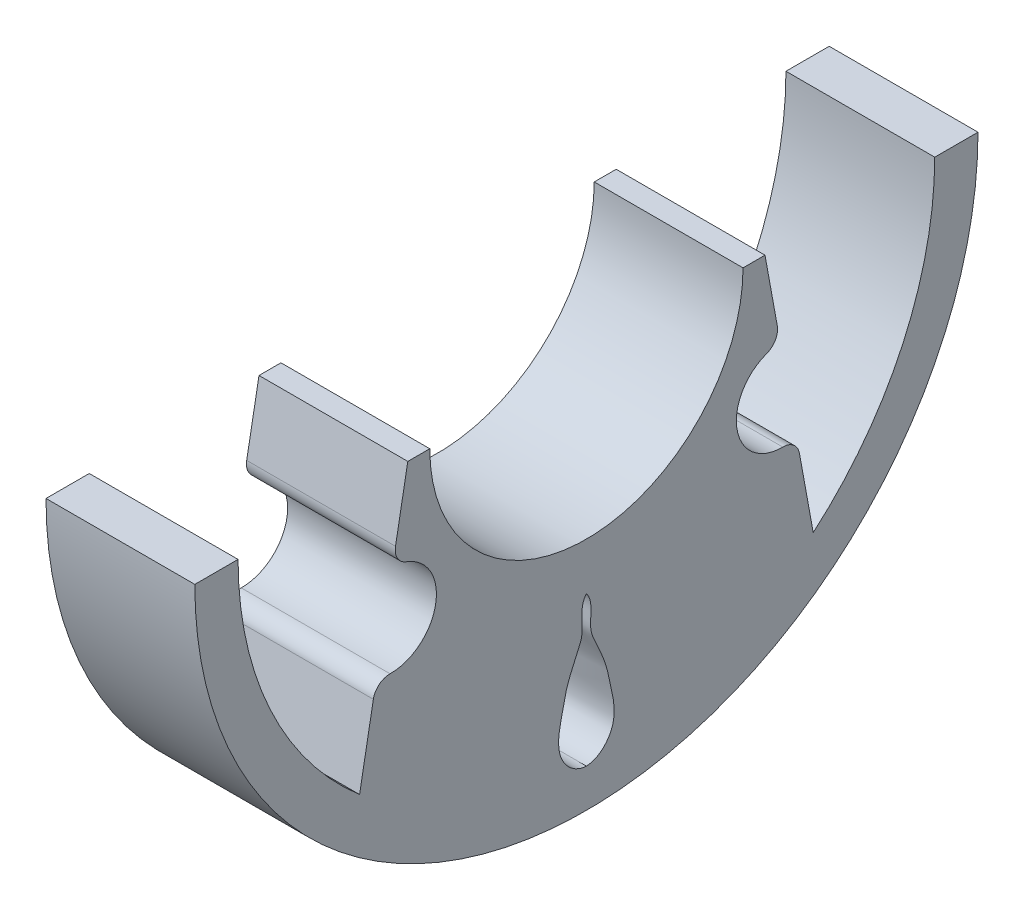
ISO-10303-21;
HEADER;
FILE_DESCRIPTION(('STEP AP214'),'2;1');
FILE_NAME('part.step','',(''),(''),'','','');
FILE_SCHEMA(('AUTOMOTIVE_DESIGN { 1 0 10303 214 1 1 1 1 }'));
ENDSEC;
DATA;
#1=APPLICATION_CONTEXT('core data for automotive mechanical design processes');
#2=APPLICATION_PROTOCOL_DEFINITION('international standard','automotive_design',2000,#1);
#3=PRODUCT_CONTEXT('',#1,'mechanical');
#4=PRODUCT('Part','Part','',(#3));
#5=PRODUCT_RELATED_PRODUCT_CATEGORY('part','',(#4));
#6=PRODUCT_DEFINITION_FORMATION('','',#4);
#7=PRODUCT_DEFINITION_CONTEXT('part definition',#1,'design');
#8=PRODUCT_DEFINITION('design','',#6,#7);
#9=PRODUCT_DEFINITION_SHAPE('','',#8);
#10=(LENGTH_UNIT() NAMED_UNIT(*) SI_UNIT(.MILLI.,.METRE.));
#11=(NAMED_UNIT(*) PLANE_ANGLE_UNIT() SI_UNIT($,.RADIAN.));
#12=(NAMED_UNIT(*) SI_UNIT($,.STERADIAN.) SOLID_ANGLE_UNIT());
#13=UNCERTAINTY_MEASURE_WITH_UNIT(LENGTH_MEASURE(1.E-05),#10,'distance_accuracy_value','');
#14=(GEOMETRIC_REPRESENTATION_CONTEXT(3) GLOBAL_UNCERTAINTY_ASSIGNED_CONTEXT((#13)) GLOBAL_UNIT_ASSIGNED_CONTEXT((#10,
#11,#12)) REPRESENTATION_CONTEXT('',''));
#15=CARTESIAN_POINT('',(0.,0.,0.));
#16=DIRECTION('',(0.,0.,1.));
#17=DIRECTION('',(1.,0.,0.));
#18=AXIS2_PLACEMENT_3D('',#15,#16,#17);
#19=CARTESIAN_POINT('',(38.,-33.,50.));
#20=DIRECTION('',(-1.,0.,0.));
#21=DIRECTION('',(0.,0.,1.));
#22=AXIS2_PLACEMENT_3D('',#19,#20,#21);
#23=CYLINDRICAL_SURFACE('',#22,11.7046999107196);
#24=CARTESIAN_POINT('',(0.,-33.,50.));
#25=DIRECTION('',(1.,0.,0.));
#26=DIRECTION('',(0.,0.,-1.));
#27=AXIS2_PLACEMENT_3D('',#24,#25,#26);
#28=CIRCLE('',#27,11.7046999107196);
#29=CARTESIAN_POINT('',(0.,-44.7038379199084,50.1420490919172));
#30=VERTEX_POINT('',#29);
#31=CARTESIAN_POINT('',(0.,-22.0000232506638,45.999936061253));
#32=VERTEX_POINT('',#31);
#33=EDGE_CURVE('E283',#30,#32,#28,.T.);
#34=ORIENTED_EDGE('',*,*,#33,.F.);
#35=DIRECTION('',(-1.,0.,0.));
#36=VECTOR('',#35,1.);
#37=CARTESIAN_POINT('',(38.,-44.7038379199084,50.1420490919172));
#38=LINE('',#37,#36);
#39=CARTESIAN_POINT('',(38.,-44.7038379199084,50.1420490919172));
#40=VERTEX_POINT('',#39);
#41=EDGE_CURVE('E11',#40,#30,#38,.T.);
#42=ORIENTED_EDGE('',*,*,#41,.F.);
#43=CARTESIAN_POINT('',(38.,-33.,50.));
#44=DIRECTION('',(1.,0.,0.));
#45=DIRECTION('',(0.,0.,-1.));
#46=AXIS2_PLACEMENT_3D('',#43,#44,#45);
#47=CIRCLE('',#46,11.7046999107196);
#48=CARTESIAN_POINT('',(38.,-22.0000232506638,45.999936061253));
#49=VERTEX_POINT('',#48);
#50=EDGE_CURVE('E297',#40,#49,#47,.T.);
#51=ORIENTED_EDGE('',*,*,#50,.T.);
#52=DIRECTION('',(-1.,0.,0.));
#53=VECTOR('',#52,1.);
#54=CARTESIAN_POINT('',(38.,-22.0000232506638,45.999936061253));
#55=LINE('',#54,#53);
#56=EDGE_CURVE('E40',#49,#32,#55,.T.);
#57=ORIENTED_EDGE('',*,*,#56,.T.);
#58=EDGE_LOOP('',(#34,#42,#51,#57));
#59=FACE_BOUND('',#58,.T.);
#60=ADVANCED_FACE('F37',(#59),#23,.F.);
#61=CARTESIAN_POINT('',(38.,-48.9835227199716,50.1939914841223));
#62=DIRECTION('',(-1.,0.,0.));
#63=DIRECTION('',(0.,0.,1.));
#64=AXIS2_PLACEMENT_3D('',#61,#62,#63);
#65=CYLINDRICAL_SURFACE('',#64,4.27999999999999);
#66=CARTESIAN_POINT('',(0.,-48.9835227199716,50.1939914841223));
#67=DIRECTION('',(-1.,0.,0.));
#68=DIRECTION('',(0.,0.,1.));
#69=AXIS2_PLACEMENT_3D('',#66,#67,#68);
#70=CIRCLE('',#69,4.27999999999999);
#71=CARTESIAN_POINT('',(0.,-48.2153535782879,54.4044921870987));
#72=VERTEX_POINT('',#71);
#73=EDGE_CURVE('E293',#72,#30,#70,.T.);
#74=ORIENTED_EDGE('',*,*,#73,.F.);
#75=DIRECTION('',(-1.,0.,0.));
#76=VECTOR('',#75,1.);
#77=CARTESIAN_POINT('',(38.,-48.2153535782879,54.4044921870987));
#78=LINE('',#77,#76);
#79=CARTESIAN_POINT('',(38.,-48.2153535782879,54.4044921870987));
#80=VERTEX_POINT('',#79);
#81=EDGE_CURVE('E45',#80,#72,#78,.T.);
#82=ORIENTED_EDGE('',*,*,#81,.F.);
#83=CARTESIAN_POINT('',(38.,-48.9835227199716,50.1939914841223));
#84=DIRECTION('',(-1.,0.,0.));
#85=DIRECTION('',(0.,0.,1.));
#86=AXIS2_PLACEMENT_3D('',#83,#84,#85);
#87=CIRCLE('',#86,4.27999999999999);
#88=EDGE_CURVE('E336',#80,#40,#87,.T.);
#89=ORIENTED_EDGE('',*,*,#88,.T.);
#90=ORIENTED_EDGE('',*,*,#41,.T.);
#91=EDGE_LOOP('',(#74,#82,#89,#90));
#92=FACE_BOUND('',#91,.T.);
#93=ADVANCED_FACE('F209',(#92),#65,.T.);
#94=CARTESIAN_POINT('',(38.,-67.5108765879659,57.924792121547));
#95=DIRECTION('',(0.,0.179478771421425,0.983761846489818));
#96=DIRECTION('',(0.,-0.983761846489818,0.179478771421425));
#97=AXIS2_PLACEMENT_3D('',#94,#95,#96);
#98=PLANE('',#97);
#99=DIRECTION('',(0.,0.983761846489818,-0.179478771421425));
#100=VECTOR('',#99,1.);
#101=CARTESIAN_POINT('',(0.,-67.5108765879659,57.924792121547));
#102=LINE('',#101,#100);
#103=CARTESIAN_POINT('',(0.,-67.5108765879659,57.9247921215471));
#104=VERTEX_POINT('',#103);
#105=EDGE_CURVE('E296',#104,#72,#102,.T.);
#106=ORIENTED_EDGE('',*,*,#105,.F.);
#107=DIRECTION('',(-1.,0.,0.));
#108=VECTOR('',#107,1.);
#109=CARTESIAN_POINT('',(38.,-67.5108765879659,57.9247921215471));
#110=LINE('',#109,#108);
#111=CARTESIAN_POINT('',(38.,-67.5108765879659,57.9247921215471));
#112=VERTEX_POINT('',#111);
#113=EDGE_CURVE('E306',#112,#104,#110,.T.);
#114=ORIENTED_EDGE('',*,*,#113,.F.);
#115=DIRECTION('',(0.,0.983761846489818,-0.179478771421425));
#116=VECTOR('',#115,1.);
#117=CARTESIAN_POINT('',(38.,-67.5108765879659,57.924792121547));
#118=LINE('',#117,#116);
#119=EDGE_CURVE('E338',#112,#80,#118,.T.);
#120=ORIENTED_EDGE('',*,*,#119,.T.);
#121=ORIENTED_EDGE('',*,*,#81,.T.);
#122=EDGE_LOOP('',(#106,#114,#120,#121));
#123=FACE_BOUND('',#122,.T.);
#124=ADVANCED_FACE('F212',(#123),#98,.T.);
#125=CARTESIAN_POINT('',(38.,0.,0.));
#126=DIRECTION('',(-1.,0.,0.));
#127=DIRECTION('',(0.,0.,1.));
#128=AXIS2_PLACEMENT_3D('',#125,#126,#127);
#129=CYLINDRICAL_SURFACE('',#128,88.9550448260244);
#130=CARTESIAN_POINT('',(0.,0.,0.));
#131=DIRECTION('',(1.,0.,0.));
#132=DIRECTION('',(0.,0.,-1.));
#133=AXIS2_PLACEMENT_3D('',#130,#131,#132);
#134=CIRCLE('',#133,88.9550448260244);
#135=CARTESIAN_POINT('',(0.,0.,88.9550448260244));
#136=VERTEX_POINT('',#135);
#137=EDGE_CURVE('E301',#136,#104,#134,.T.);
#138=ORIENTED_EDGE('',*,*,#137,.F.);
#139=DIRECTION('',(-1.,0.,0.));
#140=VECTOR('',#139,1.);
#141=CARTESIAN_POINT('',(38.,0.,88.9550448260244));
#142=LINE('',#141,#140);
#143=CARTESIAN_POINT('',(38.,0.,88.9550448260244));
#144=VERTEX_POINT('',#143);
#145=EDGE_CURVE('E308',#144,#136,#142,.T.);
#146=ORIENTED_EDGE('',*,*,#145,.F.);
#147=CARTESIAN_POINT('',(38.,0.,0.));
#148=DIRECTION('',(1.,0.,0.));
#149=DIRECTION('',(0.,0.,-1.));
#150=AXIS2_PLACEMENT_3D('',#147,#148,#149);
#151=CIRCLE('',#150,88.9550448260244);
#152=EDGE_CURVE('E342',#144,#112,#151,.T.);
#153=ORIENTED_EDGE('',*,*,#152,.T.);
#154=ORIENTED_EDGE('',*,*,#113,.T.);
#155=EDGE_LOOP('',(#138,#146,#153,#154));
#156=FACE_BOUND('',#155,.T.);
#157=ADVANCED_FACE('F216',(#156),#129,.F.);
#158=CARTESIAN_POINT('',(38.,0.,100.));
#159=DIRECTION('',(0.,1.,0.));
#160=DIRECTION('',(0.,0.,1.));
#161=AXIS2_PLACEMENT_3D('',#158,#159,#160);
#162=PLANE('',#161);
#163=DIRECTION('',(0.,0.,-1.));
#164=VECTOR('',#163,1.);
#165=CARTESIAN_POINT('',(0.,0.,100.));
#166=LINE('',#165,#164);
#167=CARTESIAN_POINT('',(0.,0.,100.));
#168=VERTEX_POINT('',#167);
#169=EDGE_CURVE('E383',#168,#136,#166,.T.);
#170=ORIENTED_EDGE('',*,*,#169,.F.);
#171=DIRECTION('',(-1.,0.,0.));
#172=VECTOR('',#171,1.);
#173=CARTESIAN_POINT('',(38.,0.,100.));
#174=LINE('',#173,#172);
#175=CARTESIAN_POINT('',(38.,0.,100.));
#176=VERTEX_POINT('',#175);
#177=EDGE_CURVE('E310',#176,#168,#174,.T.);
#178=ORIENTED_EDGE('',*,*,#177,.F.);
#179=DIRECTION('',(0.,0.,-1.));
#180=VECTOR('',#179,1.);
#181=CARTESIAN_POINT('',(38.,0.,100.));
#182=LINE('',#181,#180);
#183=EDGE_CURVE('E431',#176,#144,#182,.T.);
#184=ORIENTED_EDGE('',*,*,#183,.T.);
#185=ORIENTED_EDGE('',*,*,#145,.T.);
#186=EDGE_LOOP('',(#170,#178,#184,#185));
#187=FACE_BOUND('',#186,.T.);
#188=ADVANCED_FACE('F220',(#187),#162,.T.);
#189=CARTESIAN_POINT('',(38.,0.,0.));
#190=DIRECTION('',(-1.,0.,0.));
#191=DIRECTION('',(0.,0.,1.));
#192=AXIS2_PLACEMENT_3D('',#189,#190,#191);
#193=CYLINDRICAL_SURFACE('',#192,100.);
#194=CARTESIAN_POINT('',(0.,0.,0.));
#195=DIRECTION('',(-1.,0.,0.));
#196=DIRECTION('',(0.,0.,1.));
#197=AXIS2_PLACEMENT_3D('',#194,#195,#196);
#198=CIRCLE('',#197,100.);
#199=CARTESIAN_POINT('',(0.,0.,-100.));
#200=VERTEX_POINT('',#199);
#201=EDGE_CURVE('E380',#200,#168,#198,.T.);
#202=ORIENTED_EDGE('',*,*,#201,.F.);
#203=DIRECTION('',(-1.,0.,0.));
#204=VECTOR('',#203,1.);
#205=CARTESIAN_POINT('',(38.,0.,-100.));
#206=LINE('',#205,#204);
#207=CARTESIAN_POINT('',(38.,0.,-100.));
#208=VERTEX_POINT('',#207);
#209=EDGE_CURVE('E312',#208,#200,#206,.T.);
#210=ORIENTED_EDGE('',*,*,#209,.F.);
#211=CARTESIAN_POINT('',(38.,0.,0.));
#212=DIRECTION('',(-1.,0.,0.));
#213=DIRECTION('',(0.,0.,1.));
#214=AXIS2_PLACEMENT_3D('',#211,#212,#213);
#215=CIRCLE('',#214,100.);
#216=EDGE_CURVE('E428',#208,#176,#215,.T.);
#217=ORIENTED_EDGE('',*,*,#216,.T.);
#218=ORIENTED_EDGE('',*,*,#177,.T.);
#219=EDGE_LOOP('',(#202,#210,#217,#218));
#220=FACE_BOUND('',#219,.T.);
#221=ADVANCED_FACE('F224',(#220),#193,.T.);
#222=CARTESIAN_POINT('',(38.,0.,-88.9550448260244));
#223=DIRECTION('',(0.,1.,0.));
#224=DIRECTION('',(0.,0.,1.));
#225=AXIS2_PLACEMENT_3D('',#222,#223,#224);
#226=PLANE('',#225);
#227=DIRECTION('',(0.,0.,-1.));
#228=VECTOR('',#227,1.);
#229=CARTESIAN_POINT('',(0.,0.,-88.9550448260244));
#230=LINE('',#229,#228);
#231=CARTESIAN_POINT('',(0.,0.,-88.9550448260244));
#232=VERTEX_POINT('',#231);
#233=EDGE_CURVE('E377',#232,#200,#230,.T.);
#234=ORIENTED_EDGE('',*,*,#233,.F.);
#235=DIRECTION('',(-1.,0.,0.));
#236=VECTOR('',#235,1.);
#237=CARTESIAN_POINT('',(38.,0.,-88.9550448260244));
#238=LINE('',#237,#236);
#239=CARTESIAN_POINT('',(38.,0.,-88.9550448260244));
#240=VERTEX_POINT('',#239);
#241=EDGE_CURVE('E314',#240,#232,#238,.T.);
#242=ORIENTED_EDGE('',*,*,#241,.F.);
#243=DIRECTION('',(0.,0.,-1.));
#244=VECTOR('',#243,1.);
#245=CARTESIAN_POINT('',(38.,0.,-88.9550448260244));
#246=LINE('',#245,#244);
#247=EDGE_CURVE('E425',#240,#208,#246,.T.);
#248=ORIENTED_EDGE('',*,*,#247,.T.);
#249=ORIENTED_EDGE('',*,*,#209,.T.);
#250=EDGE_LOOP('',(#234,#242,#248,#249));
#251=FACE_BOUND('',#250,.T.);
#252=ADVANCED_FACE('F228',(#251),#226,.T.);
#253=CARTESIAN_POINT('',(38.,0.,0.));
#254=DIRECTION('',(-1.,0.,0.));
#255=DIRECTION('',(0.,0.,1.));
#256=AXIS2_PLACEMENT_3D('',#253,#254,#255);
#257=CYLINDRICAL_SURFACE('',#256,88.9550448260244);
#258=CARTESIAN_POINT('',(0.,0.,0.));
#259=DIRECTION('',(1.,0.,0.));
#260=DIRECTION('',(0.,0.,-1.));
#261=AXIS2_PLACEMENT_3D('',#258,#259,#260);
#262=CIRCLE('',#261,88.9550448260244);
#263=CARTESIAN_POINT('',(0.,-67.5108765879659,-57.9247921215471));
#264=VERTEX_POINT('',#263);
#265=EDGE_CURVE('E374',#264,#232,#262,.T.);
#266=ORIENTED_EDGE('',*,*,#265,.F.);
#267=DIRECTION('',(-1.,0.,0.));
#268=VECTOR('',#267,1.);
#269=CARTESIAN_POINT('',(38.,-67.5108765879659,-57.9247921215471));
#270=LINE('',#269,#268);
#271=CARTESIAN_POINT('',(38.,-67.5108765879659,-57.9247921215471));
#272=VERTEX_POINT('',#271);
#273=EDGE_CURVE('E316',#272,#264,#270,.T.);
#274=ORIENTED_EDGE('',*,*,#273,.F.);
#275=CARTESIAN_POINT('',(38.,0.,0.));
#276=DIRECTION('',(1.,0.,0.));
#277=DIRECTION('',(0.,0.,-1.));
#278=AXIS2_PLACEMENT_3D('',#275,#276,#277);
#279=CIRCLE('',#278,88.9550448260244);
#280=EDGE_CURVE('E422',#272,#240,#279,.T.);
#281=ORIENTED_EDGE('',*,*,#280,.T.);
#282=ORIENTED_EDGE('',*,*,#241,.T.);
#283=EDGE_LOOP('',(#266,#274,#281,#282));
#284=FACE_BOUND('',#283,.T.);
#285=ADVANCED_FACE('F232',(#284),#257,.F.);
#286=CARTESIAN_POINT('',(38.,-48.2153535782879,-54.4044921870987));
#287=DIRECTION('',(0.,0.179478771421428,-0.983761846489817));
#288=DIRECTION('',(0.,0.983761846489817,0.179478771421428));
#289=AXIS2_PLACEMENT_3D('',#286,#287,#288);
#290=PLANE('',#289);
#291=DIRECTION('',(0.,-0.983761846489817,-0.179478771421428));
#292=VECTOR('',#291,1.);
#293=CARTESIAN_POINT('',(0.,-48.2153535782879,-54.4044921870987));
#294=LINE('',#293,#292);
#295=CARTESIAN_POINT('',(0.,-48.2153535782879,-54.4044921870987));
#296=VERTEX_POINT('',#295);
#297=EDGE_CURVE('E371',#296,#264,#294,.T.);
#298=ORIENTED_EDGE('',*,*,#297,.F.);
#299=DIRECTION('',(-1.,0.,0.));
#300=VECTOR('',#299,1.);
#301=CARTESIAN_POINT('',(38.,-48.2153535782879,-54.4044921870987));
#302=LINE('',#301,#300);
#303=CARTESIAN_POINT('',(38.,-48.2153535782879,-54.4044921870987));
#304=VERTEX_POINT('',#303);
#305=EDGE_CURVE('E318',#304,#296,#302,.T.);
#306=ORIENTED_EDGE('',*,*,#305,.F.);
#307=DIRECTION('',(0.,-0.983761846489817,-0.179478771421428));
#308=VECTOR('',#307,1.);
#309=CARTESIAN_POINT('',(38.,-48.2153535782879,-54.4044921870987));
#310=LINE('',#309,#308);
#311=EDGE_CURVE('E419',#304,#272,#310,.T.);
#312=ORIENTED_EDGE('',*,*,#311,.T.);
#313=ORIENTED_EDGE('',*,*,#273,.T.);
#314=EDGE_LOOP('',(#298,#306,#312,#313));
#315=FACE_BOUND('',#314,.T.);
#316=ADVANCED_FACE('F236',(#315),#290,.T.);
#317=CARTESIAN_POINT('',(38.,-48.9835227199716,-50.1939914841223));
#318=DIRECTION('',(-1.,0.,0.));
#319=DIRECTION('',(0.,0.,1.));
#320=AXIS2_PLACEMENT_3D('',#317,#318,#319);
#321=CYLINDRICAL_SURFACE('',#320,4.28000000000002);
#322=CARTESIAN_POINT('',(0.,-48.9835227199716,-50.1939914841223));
#323=DIRECTION('',(-1.,0.,0.));
#324=DIRECTION('',(0.,0.,1.));
#325=AXIS2_PLACEMENT_3D('',#322,#323,#324);
#326=CIRCLE('',#325,4.28000000000002);
#327=CARTESIAN_POINT('',(0.,-44.7038379199084,-50.1420490919172));
#328=VERTEX_POINT('',#327);
#329=EDGE_CURVE('E368',#328,#296,#326,.T.);
#330=ORIENTED_EDGE('',*,*,#329,.F.);
#331=DIRECTION('',(-1.,0.,0.));
#332=VECTOR('',#331,1.);
#333=CARTESIAN_POINT('',(38.,-44.7038379199084,-50.1420490919172));
#334=LINE('',#333,#332);
#335=CARTESIAN_POINT('',(38.,-44.7038379199084,-50.1420490919172));
#336=VERTEX_POINT('',#335);
#337=EDGE_CURVE('E320',#336,#328,#334,.T.);
#338=ORIENTED_EDGE('',*,*,#337,.F.);
#339=CARTESIAN_POINT('',(38.,-48.9835227199716,-50.1939914841223));
#340=DIRECTION('',(-1.,0.,0.));
#341=DIRECTION('',(0.,0.,1.));
#342=AXIS2_PLACEMENT_3D('',#339,#340,#341);
#343=CIRCLE('',#342,4.28000000000002);
#344=EDGE_CURVE('E416',#336,#304,#343,.T.);
#345=ORIENTED_EDGE('',*,*,#344,.T.);
#346=ORIENTED_EDGE('',*,*,#305,.T.);
#347=EDGE_LOOP('',(#330,#338,#345,#346));
#348=FACE_BOUND('',#347,.T.);
#349=ADVANCED_FACE('F240',(#348),#321,.T.);
#350=CARTESIAN_POINT('',(38.,-33.,-50.));
#351=DIRECTION('',(-1.,0.,0.));
#352=DIRECTION('',(0.,0.,1.));
#353=AXIS2_PLACEMENT_3D('',#350,#351,#352);
#354=CYLINDRICAL_SURFACE('',#353,11.7046999107197);
#355=CARTESIAN_POINT('',(0.,-33.,-50.));
#356=DIRECTION('',(1.,0.,0.));
#357=DIRECTION('',(0.,0.,-1.));
#358=AXIS2_PLACEMENT_3D('',#355,#356,#357);
#359=CIRCLE('',#358,11.7046999107197);
#360=CARTESIAN_POINT('',(0.,-22.0000232506638,-45.999936061253));
#361=VERTEX_POINT('',#360);
#362=EDGE_CURVE('E365',#361,#328,#359,.T.);
#363=ORIENTED_EDGE('',*,*,#362,.F.);
#364=DIRECTION('',(-1.,0.,0.));
#365=VECTOR('',#364,1.);
#366=CARTESIAN_POINT('',(38.,-22.0000232506638,-45.999936061253));
#367=LINE('',#366,#365);
#368=CARTESIAN_POINT('',(38.,-22.0000232506638,-45.999936061253));
#369=VERTEX_POINT('',#368);
#370=EDGE_CURVE('E322',#369,#361,#367,.T.);
#371=ORIENTED_EDGE('',*,*,#370,.F.);
#372=CARTESIAN_POINT('',(38.,-33.,-50.));
#373=DIRECTION('',(1.,0.,0.));
#374=DIRECTION('',(0.,0.,-1.));
#375=AXIS2_PLACEMENT_3D('',#372,#373,#374);
#376=CIRCLE('',#375,11.7046999107197);
#377=EDGE_CURVE('E413',#369,#336,#376,.T.);
#378=ORIENTED_EDGE('',*,*,#377,.T.);
#379=ORIENTED_EDGE('',*,*,#337,.T.);
#380=EDGE_LOOP('',(#363,#371,#378,#379));
#381=FACE_BOUND('',#380,.T.);
#382=ADVANCED_FACE('F244',(#381),#354,.F.);
#383=CARTESIAN_POINT('',(38.,-17.9777159000891,-44.537252371075));
#384=DIRECTION('',(-1.,0.,0.));
#385=DIRECTION('',(0.,0.,1.));
#386=AXIS2_PLACEMENT_3D('',#383,#384,#385);
#387=CYLINDRICAL_SURFACE('',#386,4.27999999999996);
#388=CARTESIAN_POINT('',(0.,-17.9777159000891,-44.537252371075));
#389=DIRECTION('',(-1.,0.,0.));
#390=DIRECTION('',(0.,0.,1.));
#391=AXIS2_PLACEMENT_3D('',#388,#389,#390);
#392=CIRCLE('',#391,4.27999999999996);
#393=CARTESIAN_POINT('',(0.,-17.2095467584054,-48.7477530740514));
#394=VERTEX_POINT('',#393);
#395=EDGE_CURVE('E362',#394,#361,#392,.T.);
#396=ORIENTED_EDGE('',*,*,#395,.F.);
#397=DIRECTION('',(-1.,0.,0.));
#398=VECTOR('',#397,1.);
#399=CARTESIAN_POINT('',(38.,-17.2095467584054,-48.7477530740514));
#400=LINE('',#399,#398);
#401=CARTESIAN_POINT('',(38.,-17.2095467584054,-48.7477530740514));
#402=VERTEX_POINT('',#401);
#403=EDGE_CURVE('E324',#402,#394,#400,.T.);
#404=ORIENTED_EDGE('',*,*,#403,.F.);
#405=CARTESIAN_POINT('',(38.,-17.9777159000891,-44.537252371075));
#406=DIRECTION('',(-1.,0.,0.));
#407=DIRECTION('',(0.,0.,1.));
#408=AXIS2_PLACEMENT_3D('',#405,#406,#407);
#409=CIRCLE('',#408,4.27999999999996);
#410=EDGE_CURVE('E410',#402,#369,#409,.T.);
#411=ORIENTED_EDGE('',*,*,#410,.T.);
#412=ORIENTED_EDGE('',*,*,#370,.T.);
#413=EDGE_LOOP('',(#396,#404,#411,#412));
#414=FACE_BOUND('',#413,.T.);
#415=ADVANCED_FACE('F248',(#414),#387,.T.);
#416=CARTESIAN_POINT('',(38.,0.,-45.6080213189125));
#417=DIRECTION('',(0.,0.179478771421426,-0.983761846489818));
#418=DIRECTION('',(0.,0.983761846489818,0.179478771421426));
#419=AXIS2_PLACEMENT_3D('',#416,#417,#418);
#420=PLANE('',#419);
#421=DIRECTION('',(0.,-0.983761846489818,-0.179478771421426));
#422=VECTOR('',#421,1.);
#423=CARTESIAN_POINT('',(0.,0.,-45.6080213189125));
#424=LINE('',#423,#422);
#425=CARTESIAN_POINT('',(0.,0.,-45.6080213189125));
#426=VERTEX_POINT('',#425);
#427=EDGE_CURVE('E359',#426,#394,#424,.T.);
#428=ORIENTED_EDGE('',*,*,#427,.F.);
#429=DIRECTION('',(-1.,0.,0.));
#430=VECTOR('',#429,1.);
#431=CARTESIAN_POINT('',(38.,0.,-45.6080213189125));
#432=LINE('',#431,#430);
#433=CARTESIAN_POINT('',(38.,0.,-45.6080213189125));
#434=VERTEX_POINT('',#433);
#435=EDGE_CURVE('E326',#434,#426,#432,.T.);
#436=ORIENTED_EDGE('',*,*,#435,.F.);
#437=DIRECTION('',(0.,-0.983761846489818,-0.179478771421426));
#438=VECTOR('',#437,1.);
#439=CARTESIAN_POINT('',(38.,0.,-45.6080213189125));
#440=LINE('',#439,#438);
#441=EDGE_CURVE('E407',#434,#402,#440,.T.);
#442=ORIENTED_EDGE('',*,*,#441,.T.);
#443=ORIENTED_EDGE('',*,*,#403,.T.);
#444=EDGE_LOOP('',(#428,#436,#442,#443));
#445=FACE_BOUND('',#444,.T.);
#446=ADVANCED_FACE('F252',(#445),#420,.T.);
#447=CARTESIAN_POINT('',(38.,0.,-40.));
#448=DIRECTION('',(0.,1.,0.));
#449=DIRECTION('',(0.,0.,1.));
#450=AXIS2_PLACEMENT_3D('',#447,#448,#449);
#451=PLANE('',#450);
#452=DIRECTION('',(0.,0.,-1.));
#453=VECTOR('',#452,1.);
#454=CARTESIAN_POINT('',(0.,0.,-40.));
#455=LINE('',#454,#453);
#456=CARTESIAN_POINT('',(0.,0.,-40.));
#457=VERTEX_POINT('',#456);
#458=EDGE_CURVE('E356',#457,#426,#455,.T.);
#459=ORIENTED_EDGE('',*,*,#458,.F.);
#460=DIRECTION('',(-1.,0.,0.));
#461=VECTOR('',#460,1.);
#462=CARTESIAN_POINT('',(38.,0.,-40.));
#463=LINE('',#462,#461);
#464=CARTESIAN_POINT('',(38.,0.,-40.));
#465=VERTEX_POINT('',#464);
#466=EDGE_CURVE('E328',#465,#457,#463,.T.);
#467=ORIENTED_EDGE('',*,*,#466,.F.);
#468=DIRECTION('',(0.,0.,-1.));
#469=VECTOR('',#468,1.);
#470=CARTESIAN_POINT('',(38.,0.,-40.));
#471=LINE('',#470,#469);
#472=EDGE_CURVE('E404',#465,#434,#471,.T.);
#473=ORIENTED_EDGE('',*,*,#472,.T.);
#474=ORIENTED_EDGE('',*,*,#435,.T.);
#475=EDGE_LOOP('',(#459,#467,#473,#474));
#476=FACE_BOUND('',#475,.T.);
#477=ADVANCED_FACE('F256',(#476),#451,.T.);
#478=CARTESIAN_POINT('',(38.,0.,0.));
#479=DIRECTION('',(-1.,0.,0.));
#480=DIRECTION('',(0.,0.,1.));
#481=AXIS2_PLACEMENT_3D('',#478,#479,#480);
#482=CYLINDRICAL_SURFACE('',#481,40.);
#483=CARTESIAN_POINT('',(0.,0.,0.));
#484=DIRECTION('',(1.,0.,0.));
#485=DIRECTION('',(0.,0.,-1.));
#486=AXIS2_PLACEMENT_3D('',#483,#484,#485);
#487=CIRCLE('',#486,40.);
#488=CARTESIAN_POINT('',(0.,0.,40.));
#489=VERTEX_POINT('',#488);
#490=EDGE_CURVE('E353',#489,#457,#487,.T.);
#491=ORIENTED_EDGE('',*,*,#490,.F.);
#492=DIRECTION('',(-1.,0.,0.));
#493=VECTOR('',#492,1.);
#494=CARTESIAN_POINT('',(38.,0.,40.));
#495=LINE('',#494,#493);
#496=CARTESIAN_POINT('',(38.,0.,40.));
#497=VERTEX_POINT('',#496);
#498=EDGE_CURVE('E330',#497,#489,#495,.T.);
#499=ORIENTED_EDGE('',*,*,#498,.F.);
#500=CARTESIAN_POINT('',(38.,0.,0.));
#501=DIRECTION('',(1.,0.,0.));
#502=DIRECTION('',(0.,0.,-1.));
#503=AXIS2_PLACEMENT_3D('',#500,#501,#502);
#504=CIRCLE('',#503,40.);
#505=EDGE_CURVE('E401',#497,#465,#504,.T.);
#506=ORIENTED_EDGE('',*,*,#505,.T.);
#507=ORIENTED_EDGE('',*,*,#466,.T.);
#508=EDGE_LOOP('',(#491,#499,#506,#507));
#509=FACE_BOUND('',#508,.T.);
#510=ADVANCED_FACE('F260',(#509),#482,.F.);
#511=CARTESIAN_POINT('',(38.,0.,45.6080213189125));
#512=DIRECTION('',(0.,1.,0.));
#513=DIRECTION('',(0.,0.,1.));
#514=AXIS2_PLACEMENT_3D('',#511,#512,#513);
#515=PLANE('',#514);
#516=DIRECTION('',(0.,0.,-1.));
#517=VECTOR('',#516,1.);
#518=CARTESIAN_POINT('',(0.,0.,45.6080213189125));
#519=LINE('',#518,#517);
#520=CARTESIAN_POINT('',(0.,0.,45.6080213189125));
#521=VERTEX_POINT('',#520);
#522=EDGE_CURVE('E350',#521,#489,#519,.T.);
#523=ORIENTED_EDGE('',*,*,#522,.F.);
#524=DIRECTION('',(-1.,0.,0.));
#525=VECTOR('',#524,1.);
#526=CARTESIAN_POINT('',(38.,0.,45.6080213189125));
#527=LINE('',#526,#525);
#528=CARTESIAN_POINT('',(38.,0.,45.6080213189125));
#529=VERTEX_POINT('',#528);
#530=EDGE_CURVE('E332',#529,#521,#527,.T.);
#531=ORIENTED_EDGE('',*,*,#530,.F.);
#532=DIRECTION('',(0.,0.,-1.));
#533=VECTOR('',#532,1.);
#534=CARTESIAN_POINT('',(38.,0.,45.6080213189125));
#535=LINE('',#534,#533);
#536=EDGE_CURVE('E396',#529,#497,#535,.T.);
#537=ORIENTED_EDGE('',*,*,#536,.T.);
#538=ORIENTED_EDGE('',*,*,#498,.T.);
#539=EDGE_LOOP('',(#523,#531,#537,#538));
#540=FACE_BOUND('',#539,.T.);
#541=ADVANCED_FACE('F264',(#540),#515,.T.);
#542=CARTESIAN_POINT('',(38.,-17.2095467584054,48.7477530740514));
#543=DIRECTION('',(0.,0.179478771421424,0.983761846489818));
#544=DIRECTION('',(0.,-0.983761846489818,0.179478771421424));
#545=AXIS2_PLACEMENT_3D('',#542,#543,#544);
#546=PLANE('',#545);
#547=DIRECTION('',(0.,0.983761846489818,-0.179478771421424));
#548=VECTOR('',#547,1.);
#549=CARTESIAN_POINT('',(0.,-17.2095467584054,48.7477530740514));
#550=LINE('',#549,#548);
#551=CARTESIAN_POINT('',(0.,-17.2095467584054,48.7477530740514));
#552=VERTEX_POINT('',#551);
#553=EDGE_CURVE('E347',#552,#521,#550,.T.);
#554=ORIENTED_EDGE('',*,*,#553,.F.);
#555=DIRECTION('',(-1.,0.,0.));
#556=VECTOR('',#555,1.);
#557=CARTESIAN_POINT('',(38.,-17.2095467584054,48.7477530740514));
#558=LINE('',#557,#556);
#559=CARTESIAN_POINT('',(38.,-17.2095467584054,48.7477530740514));
#560=VERTEX_POINT('',#559);
#561=EDGE_CURVE('E333',#560,#552,#558,.T.);
#562=ORIENTED_EDGE('',*,*,#561,.F.);
#563=DIRECTION('',(0.,0.983761846489818,-0.179478771421424));
#564=VECTOR('',#563,1.);
#565=CARTESIAN_POINT('',(38.,-17.2095467584054,48.7477530740514));
#566=LINE('',#565,#564);
#567=EDGE_CURVE('E394',#560,#529,#566,.T.);
#568=ORIENTED_EDGE('',*,*,#567,.T.);
#569=ORIENTED_EDGE('',*,*,#530,.T.);
#570=EDGE_LOOP('',(#554,#562,#568,#569));
#571=FACE_BOUND('',#570,.T.);
#572=ADVANCED_FACE('F268',(#571),#546,.T.);
#573=CARTESIAN_POINT('',(38.,-17.9777159000891,44.537252371075));
#574=DIRECTION('',(-1.,0.,0.));
#575=DIRECTION('',(0.,0.,1.));
#576=AXIS2_PLACEMENT_3D('',#573,#574,#575);
#577=CYLINDRICAL_SURFACE('',#576,4.28000000000001);
#578=CARTESIAN_POINT('',(0.,-17.9777159000891,44.537252371075));
#579=DIRECTION('',(-1.,0.,0.));
#580=DIRECTION('',(0.,0.,1.));
#581=AXIS2_PLACEMENT_3D('',#578,#579,#580);
#582=CIRCLE('',#581,4.28000000000001);
#583=EDGE_CURVE('E289',#32,#552,#582,.T.);
#584=ORIENTED_EDGE('',*,*,#583,.F.);
#585=ORIENTED_EDGE('',*,*,#56,.F.);
#586=CARTESIAN_POINT('',(38.,-17.9777159000891,44.537252371075));
#587=DIRECTION('',(-1.,0.,0.));
#588=DIRECTION('',(0.,0.,1.));
#589=AXIS2_PLACEMENT_3D('',#586,#587,#588);
#590=CIRCLE('',#589,4.28000000000001);
#591=EDGE_CURVE('E299',#49,#560,#590,.T.);
#592=ORIENTED_EDGE('',*,*,#591,.T.);
#593=ORIENTED_EDGE('',*,*,#561,.T.);
#594=EDGE_LOOP('',(#584,#585,#592,#593));
#595=FACE_BOUND('',#594,.T.);
#596=ADVANCED_FACE('F205',(#595),#577,.T.);
#597=CARTESIAN_POINT('',(38.,-33.,50.));
#598=DIRECTION('',(1.,0.,0.));
#599=DIRECTION('',(0.,0.,-1.));
#600=AXIS2_PLACEMENT_3D('',#597,#598,#599);
#601=PLANE('',#600);
#602=CARTESIAN_POINT('',(38.,-52.,0.));
#603=CARTESIAN_POINT('',(38.,-55.0683064895971,-2.31482874580023));
#604=CARTESIAN_POINT('',(38.,-58.8443838076763,-0.214472049354089));
#605=CARTESIAN_POINT('',(38.,-65.5378287736961,-2.92582890750477));
#606=CARTESIAN_POINT('',(38.,-68.845366533437,-4.84113239199065));
#607=CARTESIAN_POINT('',(38.,-75.9051318682298,-6.16562500820524));
#608=CARTESIAN_POINT('',(38.,-79.446058218057,-7.45739315810399));
#609=CARTESIAN_POINT('',(38.,-86.6745872483508,-6.52745574566431));
#610=CARTESIAN_POINT('',(38.,-90.0265102967388,-3.61430509033174));
#611=CARTESIAN_POINT('',(38.,-90.1914799570311,0.));
#612=B_SPLINE_CURVE_WITH_KNOTS('',3,(#602,#603,#604,#605,#606,#607,#608,#609,#610,#611),
.UNSPECIFIED.,.F.,.F.,(4,2,2,2,4),(0.,0.25,0.5,0.75,1.),.UNSPECIFIED.);
#613=CARTESIAN_POINT('',(38.,-52.,0.));
#614=VERTEX_POINT('',#613);
#615=CARTESIAN_POINT('',(38.,-90.1914799570311,0.));
#616=VERTEX_POINT('',#615);
#617=EDGE_CURVE('E53',#614,#616,#612,.T.);
#618=ORIENTED_EDGE('',*,*,#617,.T.);
#619=CARTESIAN_POINT('',(38.,-90.1914799570311,0.));
#620=CARTESIAN_POINT('',(38.,-90.0265102967388,3.61430509033174));
#621=CARTESIAN_POINT('',(38.,-86.6745872483508,6.52745574566432));
#622=CARTESIAN_POINT('',(38.,-79.446058218057,7.45739315810399));
#623=CARTESIAN_POINT('',(38.,-75.9051318682298,6.16562500820524));
#624=CARTESIAN_POINT('',(38.,-68.845366533437,4.84113239199065));
#625=CARTESIAN_POINT('',(38.,-65.5378287736961,2.92582890750477));
#626=CARTESIAN_POINT('',(38.,-58.8443838076762,0.214472049354088));
#627=CARTESIAN_POINT('',(38.,-55.0683064895971,2.31482874580023));
#628=CARTESIAN_POINT('',(38.,-52.,0.));
#629=B_SPLINE_CURVE_WITH_KNOTS('',3,(#619,#620,#621,#622,#623,#624,#625,#626,#627,#628),
.UNSPECIFIED.,.F.,.F.,(4,2,2,2,4),(0.,0.25,0.5,0.75,1.),.UNSPECIFIED.);
#630=EDGE_CURVE('E177',#616,#614,#629,.T.);
#631=ORIENTED_EDGE('',*,*,#630,.T.);
#632=EDGE_LOOP('',(#618,#631));
#633=FACE_BOUND('',#632,.T.);
#634=ORIENTED_EDGE('',*,*,#50,.F.);
#635=ORIENTED_EDGE('',*,*,#88,.F.);
#636=ORIENTED_EDGE('',*,*,#119,.F.);
#637=ORIENTED_EDGE('',*,*,#152,.F.);
#638=ORIENTED_EDGE('',*,*,#183,.F.);
#639=ORIENTED_EDGE('',*,*,#216,.F.);
#640=ORIENTED_EDGE('',*,*,#247,.F.);
#641=ORIENTED_EDGE('',*,*,#280,.F.);
#642=ORIENTED_EDGE('',*,*,#311,.F.);
#643=ORIENTED_EDGE('',*,*,#344,.F.);
#644=ORIENTED_EDGE('',*,*,#377,.F.);
#645=ORIENTED_EDGE('',*,*,#410,.F.);
#646=ORIENTED_EDGE('',*,*,#441,.F.);
#647=ORIENTED_EDGE('',*,*,#472,.F.);
#648=ORIENTED_EDGE('',*,*,#505,.F.);
#649=ORIENTED_EDGE('',*,*,#536,.F.);
#650=ORIENTED_EDGE('',*,*,#567,.F.);
#651=ORIENTED_EDGE('',*,*,#591,.F.);
#652=EDGE_LOOP('',(#634,#635,#636,#637,#638,#639,#640,#641,#642,#643,#644,#645,#646,#647,#648,
#649,#650,#651));
#653=FACE_BOUND('',#652,.T.);
#654=ADVANCED_FACE('F183',(#633,#653),#601,.T.);
#655=CARTESIAN_POINT('',(0.,-33.,50.));
#656=DIRECTION('',(1.,0.,0.));
#657=DIRECTION('',(0.,0.,-1.));
#658=AXIS2_PLACEMENT_3D('',#655,#656,#657);
#659=PLANE('',#658);
#660=CARTESIAN_POINT('',(0.,-90.1914799570311,0.));
#661=CARTESIAN_POINT('',(0.,-90.0265102967388,3.61430509033174));
#662=CARTESIAN_POINT('',(0.,-86.6745872483508,6.52745574566432));
#663=CARTESIAN_POINT('',(0.,-79.446058218057,7.45739315810399));
#664=CARTESIAN_POINT('',(0.,-75.9051318682298,6.16562500820524));
#665=CARTESIAN_POINT('',(0.,-68.845366533437,4.84113239199065));
#666=CARTESIAN_POINT('',(0.,-65.5378287736961,2.92582890750477));
#667=CARTESIAN_POINT('',(0.,-58.8443838076762,0.214472049354088));
#668=CARTESIAN_POINT('',(0.,-55.0683064895971,2.31482874580023));
#669=CARTESIAN_POINT('',(0.,-52.,0.));
#670=B_SPLINE_CURVE_WITH_KNOTS('',3,(#660,#661,#662,#663,#664,#665,#666,#667,#668,#669),
.UNSPECIFIED.,.F.,.F.,(4,2,2,2,4),(0.,0.25,0.5,0.75,1.),.UNSPECIFIED.);
#671=CARTESIAN_POINT('',(0.,-90.1914799570311,0.));
#672=VERTEX_POINT('',#671);
#673=CARTESIAN_POINT('',(0.,-52.,0.));
#674=VERTEX_POINT('',#673);
#675=EDGE_CURVE('E185',#672,#674,#670,.T.);
#676=ORIENTED_EDGE('',*,*,#675,.F.);
#677=CARTESIAN_POINT('',(0.,-52.,0.));
#678=CARTESIAN_POINT('',(0.,-55.0683064895971,-2.31482874580023));
#679=CARTESIAN_POINT('',(0.,-58.8443838076763,-0.214472049354089));
#680=CARTESIAN_POINT('',(0.,-65.5378287736961,-2.92582890750477));
#681=CARTESIAN_POINT('',(0.,-68.845366533437,-4.84113239199065));
#682=CARTESIAN_POINT('',(0.,-75.9051318682298,-6.16562500820524));
#683=CARTESIAN_POINT('',(0.,-79.446058218057,-7.45739315810399));
#684=CARTESIAN_POINT('',(0.,-86.6745872483508,-6.52745574566431));
#685=CARTESIAN_POINT('',(0.,-90.0265102967388,-3.61430509033174));
#686=CARTESIAN_POINT('',(0.,-90.1914799570311,0.));
#687=B_SPLINE_CURVE_WITH_KNOTS('',3,(#677,#678,#679,#680,#681,#682,#683,#684,#685,#686),
.UNSPECIFIED.,.F.,.F.,(4,2,2,2,4),(0.,0.25,0.5,0.75,1.),.UNSPECIFIED.);
#688=EDGE_CURVE('E58',#674,#672,#687,.T.);
#689=ORIENTED_EDGE('',*,*,#688,.F.);
#690=EDGE_LOOP('',(#676,#689));
#691=FACE_BOUND('',#690,.T.);
#692=ORIENTED_EDGE('',*,*,#33,.T.);
#693=ORIENTED_EDGE('',*,*,#583,.T.);
#694=ORIENTED_EDGE('',*,*,#553,.T.);
#695=ORIENTED_EDGE('',*,*,#522,.T.);
#696=ORIENTED_EDGE('',*,*,#490,.T.);
#697=ORIENTED_EDGE('',*,*,#458,.T.);
#698=ORIENTED_EDGE('',*,*,#427,.T.);
#699=ORIENTED_EDGE('',*,*,#395,.T.);
#700=ORIENTED_EDGE('',*,*,#362,.T.);
#701=ORIENTED_EDGE('',*,*,#329,.T.);
#702=ORIENTED_EDGE('',*,*,#297,.T.);
#703=ORIENTED_EDGE('',*,*,#265,.T.);
#704=ORIENTED_EDGE('',*,*,#233,.T.);
#705=ORIENTED_EDGE('',*,*,#201,.T.);
#706=ORIENTED_EDGE('',*,*,#169,.T.);
#707=ORIENTED_EDGE('',*,*,#137,.T.);
#708=ORIENTED_EDGE('',*,*,#105,.T.);
#709=ORIENTED_EDGE('',*,*,#73,.T.);
#710=EDGE_LOOP('',(#692,#693,#694,#695,#696,#697,#698,#699,#700,#701,#702,#703,#704,#705,#706,
#707,#708,#709));
#711=FACE_BOUND('',#710,.T.);
#712=ADVANCED_FACE('F202',(#691,#711),#659,.F.);
#713=DIRECTION('',(-1.,0.,0.));
#714=VECTOR('',#713,1.);
#715=SURFACE_OF_LINEAR_EXTRUSION('',#612,#714);
#716=ORIENTED_EDGE('',*,*,#688,.T.);
#717=DIRECTION('',(-1.,0.,0.));
#718=VECTOR('',#717,1.);
#719=CARTESIAN_POINT('',(38.,-90.1914799570311,0.));
#720=LINE('',#719,#718);
#721=EDGE_CURVE('E170',#616,#672,#720,.T.);
#722=ORIENTED_EDGE('',*,*,#721,.F.);
#723=ORIENTED_EDGE('',*,*,#617,.F.);
#724=DIRECTION('',(-1.,0.,0.));
#725=VECTOR('',#724,1.);
#726=CARTESIAN_POINT('',(38.,-52.,0.));
#727=LINE('',#726,#725);
#728=EDGE_CURVE('E176',#614,#674,#727,.T.);
#729=ORIENTED_EDGE('',*,*,#728,.T.);
#730=EDGE_LOOP('',(#716,#722,#723,#729));
#731=FACE_BOUND('',#730,.T.);
#732=ADVANCED_FACE('F172',(#731),#715,.F.);
#733=DIRECTION('',(-1.,0.,0.));
#734=VECTOR('',#733,1.);
#735=SURFACE_OF_LINEAR_EXTRUSION('',#629,#734);
#736=ORIENTED_EDGE('',*,*,#675,.T.);
#737=ORIENTED_EDGE('',*,*,#728,.F.);
#738=ORIENTED_EDGE('',*,*,#630,.F.);
#739=ORIENTED_EDGE('',*,*,#721,.T.);
#740=EDGE_LOOP('',(#736,#737,#738,#739));
#741=FACE_BOUND('',#740,.T.);
#742=ADVANCED_FACE('F180',(#741),#735,.F.);
#743=CLOSED_SHELL('',(#60,#93,#124,#157,#188,#221,#252,#285,#316,#349,#382,#415,#446,#477,#510,
#541,#572,#596,#654,#712,#732,#742));
#744=MANIFOLD_SOLID_BREP('B2',#743);
#745=ADVANCED_BREP_SHAPE_REPRESENTATION('',(#18,#744),#14);
#746=SHAPE_DEFINITION_REPRESENTATION(#9,#745);
ENDSEC;
END-ISO-10303-21;
